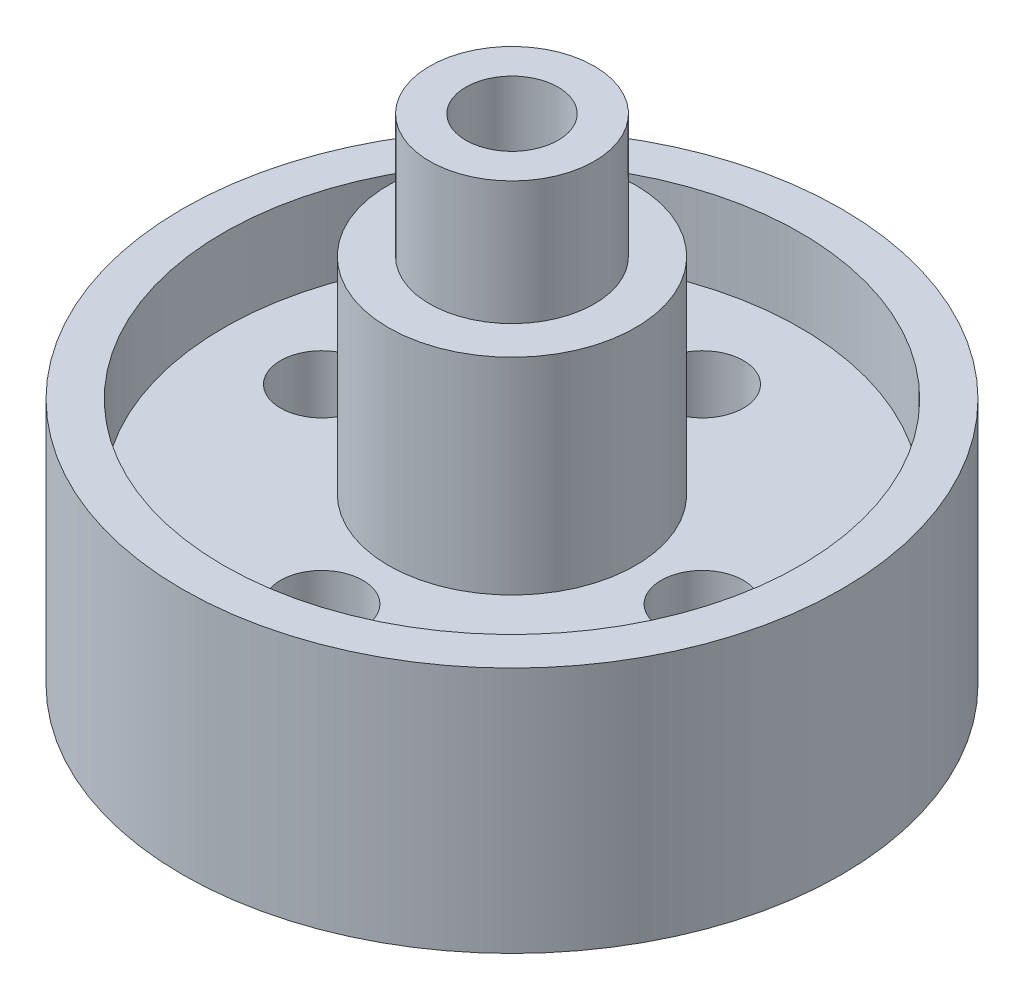
ISO-10303-21;
HEADER;
FILE_DESCRIPTION(('STEP AP214'),'2;1');
FILE_NAME('part.step','',(''),(''),'','','');
FILE_SCHEMA(('AUTOMOTIVE_DESIGN { 1 0 10303 214 1 1 1 1 }'));
ENDSEC;
DATA;
#1=APPLICATION_CONTEXT('core data for automotive mechanical design processes');
#2=APPLICATION_PROTOCOL_DEFINITION('international standard','automotive_design',2000,#1);
#3=PRODUCT_CONTEXT('',#1,'mechanical');
#4=PRODUCT('Part','Part','',(#3));
#5=PRODUCT_RELATED_PRODUCT_CATEGORY('part','',(#4));
#6=PRODUCT_DEFINITION_FORMATION('','',#4);
#7=PRODUCT_DEFINITION_CONTEXT('part definition',#1,'design');
#8=PRODUCT_DEFINITION('design','',#6,#7);
#9=PRODUCT_DEFINITION_SHAPE('','',#8);
#10=(LENGTH_UNIT() NAMED_UNIT(*) SI_UNIT(.MILLI.,.METRE.));
#11=(NAMED_UNIT(*) PLANE_ANGLE_UNIT() SI_UNIT($,.RADIAN.));
#12=(NAMED_UNIT(*) SI_UNIT($,.STERADIAN.) SOLID_ANGLE_UNIT());
#13=UNCERTAINTY_MEASURE_WITH_UNIT(LENGTH_MEASURE(1.E-05),#10,'distance_accuracy_value','');
#14=(GEOMETRIC_REPRESENTATION_CONTEXT(3) GLOBAL_UNCERTAINTY_ASSIGNED_CONTEXT((#13)) GLOBAL_UNIT_ASSIGNED_CONTEXT((#10,
#11,#12)) REPRESENTATION_CONTEXT('',''));
#15=CARTESIAN_POINT('',(0.,0.,0.));
#16=DIRECTION('',(0.,0.,1.));
#17=DIRECTION('',(1.,0.,0.));
#18=AXIS2_PLACEMENT_3D('',#15,#16,#17);
#19=CARTESIAN_POINT('',(0.,25.4,0.));
#20=DIRECTION('',(0.,-1.,0.));
#21=DIRECTION('',(0.,0.,-1.));
#22=AXIS2_PLACEMENT_3D('',#19,#20,#21);
#23=CYLINDRICAL_SURFACE('',#22,50.8);
#24=CARTESIAN_POINT('',(0.,0.,0.));
#25=DIRECTION('',(0.,1.,0.));
#26=DIRECTION('',(0.,0.,1.));
#27=AXIS2_PLACEMENT_3D('',#24,#25,#26);
#28=CIRCLE('',#27,50.8);
#29=CARTESIAN_POINT('',(0.,0.,50.8));
#30=VERTEX_POINT('',#29);
#31=EDGE_CURVE('E42',#30,#30,#28,.T.);
#32=ORIENTED_EDGE('',*,*,#31,.T.);
#33=EDGE_LOOP('',(#32));
#34=FACE_BOUND('',#33,.T.);
#35=CARTESIAN_POINT('',(0.,38.1,0.));
#36=DIRECTION('',(0.,1.,0.));
#37=DIRECTION('',(0.,0.,1.));
#38=AXIS2_PLACEMENT_3D('',#35,#36,#37);
#39=CIRCLE('',#38,50.8);
#40=CARTESIAN_POINT('',(0.,38.1,50.8));
#41=VERTEX_POINT('',#40);
#42=EDGE_CURVE('E56',#41,#41,#39,.T.);
#43=ORIENTED_EDGE('',*,*,#42,.F.);
#44=EDGE_LOOP('',(#43));
#45=FACE_BOUND('',#44,.T.);
#46=ADVANCED_FACE('F31',(#34,#45),#23,.T.);
#47=CARTESIAN_POINT('',(0.,0.,0.));
#48=DIRECTION('',(0.,1.,0.));
#49=DIRECTION('',(0.,0.,1.));
#50=AXIS2_PLACEMENT_3D('',#47,#48,#49);
#51=PLANE('',#50);
#52=CARTESIAN_POINT('',(-29.337,0.,0.));
#53=DIRECTION('',(0.,1.,0.));
#54=DIRECTION('',(0.,0.,1.));
#55=AXIS2_PLACEMENT_3D('',#52,#53,#54);
#56=CIRCLE('',#55,6.35);
#57=CARTESIAN_POINT('',(-29.337,0.,6.35));
#58=VERTEX_POINT('',#57);
#59=EDGE_CURVE('E123',#58,#58,#56,.T.);
#60=ORIENTED_EDGE('',*,*,#59,.T.);
#61=EDGE_LOOP('',(#60));
#62=FACE_BOUND('',#61,.T.);
#63=CARTESIAN_POINT('',(1.02429588037641E-13,0.,-29.337));
#64=DIRECTION('',(0.,1.,0.));
#65=DIRECTION('',(0.,0.,1.));
#66=AXIS2_PLACEMENT_3D('',#63,#64,#65);
#67=CIRCLE('',#66,6.35);
#68=CARTESIAN_POINT('',(1.02429588037641E-13,0.,-22.987));
#69=VERTEX_POINT('',#68);
#70=EDGE_CURVE('E127',#69,#69,#67,.T.);
#71=ORIENTED_EDGE('',*,*,#70,.T.);
#72=EDGE_LOOP('',(#71));
#73=FACE_BOUND('',#72,.T.);
#74=CARTESIAN_POINT('',(29.337,0.,2.04859176075282E-13));
#75=DIRECTION('',(0.,1.,0.));
#76=DIRECTION('',(0.,0.,1.));
#77=AXIS2_PLACEMENT_3D('',#74,#75,#76);
#78=CIRCLE('',#77,6.35);
#79=CARTESIAN_POINT('',(29.337,0.,6.35000000000021));
#80=VERTEX_POINT('',#79);
#81=EDGE_CURVE('E137',#80,#80,#78,.T.);
#82=ORIENTED_EDGE('',*,*,#81,.T.);
#83=EDGE_LOOP('',(#82));
#84=FACE_BOUND('',#83,.T.);
#85=CARTESIAN_POINT('',(-3.07288764112923E-13,0.,29.337));
#86=DIRECTION('',(0.,1.,0.));
#87=DIRECTION('',(0.,0.,1.));
#88=AXIS2_PLACEMENT_3D('',#85,#86,#87);
#89=CIRCLE('',#88,6.35);
#90=CARTESIAN_POINT('',(-3.07288764112923E-13,0.,35.687));
#91=VERTEX_POINT('',#90);
#92=EDGE_CURVE('E143',#91,#91,#89,.T.);
#93=ORIENTED_EDGE('',*,*,#92,.T.);
#94=EDGE_LOOP('',(#93));
#95=FACE_BOUND('',#94,.T.);
#96=CARTESIAN_POINT('',(0.,0.,0.));
#97=DIRECTION('',(0.,1.,0.));
#98=DIRECTION('',(0.,0.,1.));
#99=AXIS2_PLACEMENT_3D('',#96,#97,#98);
#100=CIRCLE('',#99,7.112);
#101=CARTESIAN_POINT('',(0.,0.,7.112));
#102=VERTEX_POINT('',#101);
#103=EDGE_CURVE('E149',#102,#102,#100,.T.);
#104=ORIENTED_EDGE('',*,*,#103,.T.);
#105=EDGE_LOOP('',(#104));
#106=FACE_BOUND('',#105,.T.);
#107=ORIENTED_EDGE('',*,*,#31,.F.);
#108=EDGE_LOOP('',(#107));
#109=FACE_BOUND('',#108,.T.);
#110=ADVANCED_FACE('F63',(#62,#73,#84,#95,#106,#109),#51,.F.);
#111=CARTESIAN_POINT('',(0.,38.1,0.));
#112=DIRECTION('',(0.,1.,0.));
#113=DIRECTION('',(0.,0.,1.));
#114=AXIS2_PLACEMENT_3D('',#111,#112,#113);
#115=PLANE('',#114);
#116=ORIENTED_EDGE('',*,*,#42,.T.);
#117=EDGE_LOOP('',(#116));
#118=FACE_BOUND('',#117,.T.);
#119=CARTESIAN_POINT('',(0.,38.1,0.));
#120=DIRECTION('',(0.,1.,0.));
#121=DIRECTION('',(0.,0.,1.));
#122=AXIS2_PLACEMENT_3D('',#119,#120,#121);
#123=CIRCLE('',#122,44.45);
#124=CARTESIAN_POINT('',(0.,38.1,44.45));
#125=VERTEX_POINT('',#124);
#126=EDGE_CURVE('E50',#125,#125,#123,.T.);
#127=ORIENTED_EDGE('',*,*,#126,.F.);
#128=EDGE_LOOP('',(#127));
#129=FACE_BOUND('',#128,.T.);
#130=ADVANCED_FACE('F65',(#118,#129),#115,.T.);
#131=CARTESIAN_POINT('',(0.,38.1,0.));
#132=DIRECTION('',(0.,-1.,0.));
#133=DIRECTION('',(0.,0.,-1.));
#134=AXIS2_PLACEMENT_3D('',#131,#132,#133);
#135=CYLINDRICAL_SURFACE('',#134,44.45);
#136=ORIENTED_EDGE('',*,*,#126,.T.);
#137=EDGE_LOOP('',(#136));
#138=FACE_BOUND('',#137,.T.);
#139=CARTESIAN_POINT('',(0.,25.4,0.));
#140=DIRECTION('',(0.,1.,0.));
#141=DIRECTION('',(0.,0.,1.));
#142=AXIS2_PLACEMENT_3D('',#139,#140,#141);
#143=CIRCLE('',#142,44.45);
#144=CARTESIAN_POINT('',(0.,25.4,44.45));
#145=VERTEX_POINT('',#144);
#146=EDGE_CURVE('E34',#145,#145,#143,.F.);
#147=ORIENTED_EDGE('',*,*,#146,.T.);
#148=EDGE_LOOP('',(#147));
#149=FACE_BOUND('',#148,.T.);
#150=ADVANCED_FACE('F71',(#138,#149),#135,.F.);
#151=CARTESIAN_POINT('',(0.,25.4,0.));
#152=DIRECTION('',(0.,1.,0.));
#153=DIRECTION('',(0.,0.,1.));
#154=AXIS2_PLACEMENT_3D('',#151,#152,#153);
#155=PLANE('',#154);
#156=CARTESIAN_POINT('',(-29.337,25.4,0.));
#157=DIRECTION('',(0.,1.,0.));
#158=DIRECTION('',(0.,0.,1.));
#159=AXIS2_PLACEMENT_3D('',#156,#157,#158);
#160=CIRCLE('',#159,6.35);
#161=CARTESIAN_POINT('',(-29.337,25.4,6.35));
#162=VERTEX_POINT('',#161);
#163=EDGE_CURVE('E126',#162,#162,#160,.T.);
#164=ORIENTED_EDGE('',*,*,#163,.F.);
#165=EDGE_LOOP('',(#164));
#166=FACE_BOUND('',#165,.T.);
#167=CARTESIAN_POINT('',(1.02429588037641E-13,25.4,-29.337));
#168=DIRECTION('',(0.,1.,0.));
#169=DIRECTION('',(0.,0.,1.));
#170=AXIS2_PLACEMENT_3D('',#167,#168,#169);
#171=CIRCLE('',#170,6.35);
#172=CARTESIAN_POINT('',(1.02429588037641E-13,25.4,-22.987));
#173=VERTEX_POINT('',#172);
#174=EDGE_CURVE('E132',#173,#173,#171,.T.);
#175=ORIENTED_EDGE('',*,*,#174,.F.);
#176=EDGE_LOOP('',(#175));
#177=FACE_BOUND('',#176,.T.);
#178=CARTESIAN_POINT('',(29.337,25.4,2.04859176075282E-13));
#179=DIRECTION('',(0.,1.,0.));
#180=DIRECTION('',(0.,0.,1.));
#181=AXIS2_PLACEMENT_3D('',#178,#179,#180);
#182=CIRCLE('',#181,6.35);
#183=CARTESIAN_POINT('',(29.337,25.4,6.35000000000021));
#184=VERTEX_POINT('',#183);
#185=EDGE_CURVE('E140',#184,#184,#182,.T.);
#186=ORIENTED_EDGE('',*,*,#185,.F.);
#187=EDGE_LOOP('',(#186));
#188=FACE_BOUND('',#187,.T.);
#189=CARTESIAN_POINT('',(-3.07288764112923E-13,25.4,29.337));
#190=DIRECTION('',(0.,1.,0.));
#191=DIRECTION('',(0.,0.,1.));
#192=AXIS2_PLACEMENT_3D('',#189,#190,#191);
#193=CIRCLE('',#192,6.35);
#194=CARTESIAN_POINT('',(-3.07288764112923E-13,25.4,35.687));
#195=VERTEX_POINT('',#194);
#196=EDGE_CURVE('E146',#195,#195,#193,.T.);
#197=ORIENTED_EDGE('',*,*,#196,.F.);
#198=EDGE_LOOP('',(#197));
#199=FACE_BOUND('',#198,.T.);
#200=CARTESIAN_POINT('',(0.,25.4,0.));
#201=DIRECTION('',(0.,1.,0.));
#202=DIRECTION('',(0.,0.,1.));
#203=AXIS2_PLACEMENT_3D('',#200,#201,#202);
#204=CIRCLE('',#203,19.05);
#205=CARTESIAN_POINT('',(0.,25.4,19.05));
#206=VERTEX_POINT('',#205);
#207=EDGE_CURVE('E51',#206,#206,#204,.T.);
#208=ORIENTED_EDGE('',*,*,#207,.F.);
#209=EDGE_LOOP('',(#208));
#210=FACE_BOUND('',#209,.T.);
#211=ORIENTED_EDGE('',*,*,#146,.F.);
#212=EDGE_LOOP('',(#211));
#213=FACE_BOUND('',#212,.T.);
#214=ADVANCED_FACE('F77',(#166,#177,#188,#199,#210,#213),#155,.T.);
#215=CARTESIAN_POINT('',(0.,57.15,0.));
#216=DIRECTION('',(0.,-1.,0.));
#217=DIRECTION('',(0.,0.,-1.));
#218=AXIS2_PLACEMENT_3D('',#215,#216,#217);
#219=CYLINDRICAL_SURFACE('',#218,19.05);
#220=CARTESIAN_POINT('',(0.,57.15,0.));
#221=DIRECTION('',(0.,1.,0.));
#222=DIRECTION('',(0.,0.,1.));
#223=AXIS2_PLACEMENT_3D('',#220,#221,#222);
#224=CIRCLE('',#223,19.05);
#225=CARTESIAN_POINT('',(0.,57.15,19.05));
#226=VERTEX_POINT('',#225);
#227=EDGE_CURVE('E47',#226,#226,#224,.T.);
#228=ORIENTED_EDGE('',*,*,#227,.F.);
#229=EDGE_LOOP('',(#228));
#230=FACE_BOUND('',#229,.T.);
#231=ORIENTED_EDGE('',*,*,#207,.T.);
#232=EDGE_LOOP('',(#231));
#233=FACE_BOUND('',#232,.T.);
#234=ADVANCED_FACE('F79',(#230,#233),#219,.T.);
#235=CARTESIAN_POINT('',(0.,57.15,0.));
#236=DIRECTION('',(0.,1.,0.));
#237=DIRECTION('',(0.,0.,1.));
#238=AXIS2_PLACEMENT_3D('',#235,#236,#237);
#239=PLANE('',#238);
#240=CARTESIAN_POINT('',(0.,57.15,0.));
#241=DIRECTION('',(0.,1.,0.));
#242=DIRECTION('',(0.,0.,1.));
#243=AXIS2_PLACEMENT_3D('',#240,#241,#242);
#244=CIRCLE('',#243,12.7);
#245=CARTESIAN_POINT('',(0.,57.15,-12.7));
#246=VERTEX_POINT('',#245);
#247=EDGE_CURVE('E10',#246,#246,#244,.T.);
#248=ORIENTED_EDGE('',*,*,#247,.F.);
#249=EDGE_LOOP('',(#248));
#250=FACE_BOUND('',#249,.T.);
#251=ORIENTED_EDGE('',*,*,#227,.T.);
#252=EDGE_LOOP('',(#251));
#253=FACE_BOUND('',#252,.T.);
#254=ADVANCED_FACE('F87',(#250,#253),#239,.T.);
#255=CARTESIAN_POINT('',(0.,76.2,0.));
#256=DIRECTION('',(0.,-1.,0.));
#257=DIRECTION('',(0.,0.,-1.));
#258=AXIS2_PLACEMENT_3D('',#255,#256,#257);
#259=CYLINDRICAL_SURFACE('',#258,12.7);
#260=CARTESIAN_POINT('',(0.,76.2,0.));
#261=DIRECTION('',(0.,1.,0.));
#262=DIRECTION('',(0.,0.,1.));
#263=AXIS2_PLACEMENT_3D('',#260,#261,#262);
#264=CIRCLE('',#263,12.7);
#265=CARTESIAN_POINT('',(0.,76.2,-12.7));
#266=VERTEX_POINT('',#265);
#267=EDGE_CURVE('E45',#266,#266,#264,.T.);
#268=CARTESIAN_POINT('',(0.,76.2,-12.7));
#269=CARTESIAN_POINT('',(0.,76.0015625,-12.7));
#270=CARTESIAN_POINT('',(0.,75.803125,-12.7));
#271=CARTESIAN_POINT('',(0.,75.40625,-12.7));
#272=CARTESIAN_POINT('',(0.,75.2078125,-12.7));
#273=CARTESIAN_POINT('',(0.,74.8109375,-12.7));
#274=CARTESIAN_POINT('',(0.,74.6125,-12.7));
#275=CARTESIAN_POINT('',(0.,74.215625,-12.7));
#276=CARTESIAN_POINT('',(0.,74.0171875,-12.7));
#277=CARTESIAN_POINT('',(0.,73.6203125,-12.7));
#278=CARTESIAN_POINT('',(0.,73.421875,-12.7));
#279=CARTESIAN_POINT('',(0.,73.025,-12.7));
#280=CARTESIAN_POINT('',(0.,72.8265625,-12.7));
#281=CARTESIAN_POINT('',(0.,72.4296875,-12.7));
#282=CARTESIAN_POINT('',(0.,72.23125,-12.7));
#283=CARTESIAN_POINT('',(0.,71.834375,-12.7));
#284=CARTESIAN_POINT('',(0.,71.6359375,-12.7));
#285=CARTESIAN_POINT('',(0.,71.2390625,-12.7));
#286=CARTESIAN_POINT('',(0.,71.040625,-12.7));
#287=CARTESIAN_POINT('',(0.,70.64375,-12.7));
#288=CARTESIAN_POINT('',(0.,70.4453125,-12.7));
#289=CARTESIAN_POINT('',(0.,70.0484375,-12.7));
#290=CARTESIAN_POINT('',(0.,69.85,-12.7));
#291=CARTESIAN_POINT('',(0.,69.453125,-12.7));
#292=CARTESIAN_POINT('',(0.,69.2546875,-12.7));
#293=CARTESIAN_POINT('',(0.,68.8578125,-12.7));
#294=CARTESIAN_POINT('',(0.,68.659375,-12.7));
#295=CARTESIAN_POINT('',(0.,68.2625,-12.7));
#296=CARTESIAN_POINT('',(0.,68.0640625,-12.7));
#297=CARTESIAN_POINT('',(0.,67.6671875,-12.7));
#298=CARTESIAN_POINT('',(0.,67.46875,-12.7));
#299=CARTESIAN_POINT('',(0.,67.071875,-12.7));
#300=CARTESIAN_POINT('',(0.,66.8734375,-12.7));
#301=CARTESIAN_POINT('',(0.,66.4765625,-12.7));
#302=CARTESIAN_POINT('',(0.,66.278125,-12.7));
#303=CARTESIAN_POINT('',(0.,65.88125,-12.7));
#304=CARTESIAN_POINT('',(0.,65.6828125,-12.7));
#305=CARTESIAN_POINT('',(0.,65.2859375,-12.7));
#306=CARTESIAN_POINT('',(0.,65.0875,-12.7));
#307=CARTESIAN_POINT('',(0.,64.690625,-12.7));
#308=CARTESIAN_POINT('',(0.,64.4921875,-12.7));
#309=CARTESIAN_POINT('',(0.,64.0953125,-12.7));
#310=CARTESIAN_POINT('',(0.,63.896875,-12.7));
#311=CARTESIAN_POINT('',(0.,63.5,-12.7));
#312=CARTESIAN_POINT('',(0.,63.3015625,-12.7));
#313=CARTESIAN_POINT('',(0.,62.9046875,-12.7));
#314=CARTESIAN_POINT('',(0.,62.70625,-12.7));
#315=CARTESIAN_POINT('',(0.,62.309375,-12.7));
#316=CARTESIAN_POINT('',(0.,62.1109375,-12.7));
#317=CARTESIAN_POINT('',(0.,61.7140625,-12.7));
#318=CARTESIAN_POINT('',(0.,61.515625,-12.7));
#319=CARTESIAN_POINT('',(0.,61.11875,-12.7));
#320=CARTESIAN_POINT('',(0.,60.9203125,-12.7));
#321=CARTESIAN_POINT('',(0.,60.5234375,-12.7));
#322=CARTESIAN_POINT('',(0.,60.325,-12.7));
#323=CARTESIAN_POINT('',(0.,59.928125,-12.7));
#324=CARTESIAN_POINT('',(0.,59.7296875,-12.7));
#325=CARTESIAN_POINT('',(0.,59.3328125,-12.7));
#326=CARTESIAN_POINT('',(0.,59.134375,-12.7));
#327=CARTESIAN_POINT('',(0.,58.7375,-12.7));
#328=CARTESIAN_POINT('',(0.,58.5390625,-12.7));
#329=CARTESIAN_POINT('',(0.,58.1421875,-12.7));
#330=CARTESIAN_POINT('',(0.,57.94375,-12.7));
#331=CARTESIAN_POINT('',(0.,57.546875,-12.7));
#332=CARTESIAN_POINT('',(0.,57.3484375,-12.7));
#333=CARTESIAN_POINT('',(0.,57.15,-12.7));
#334=B_SPLINE_CURVE_WITH_KNOTS('',3,(#268,#269,#270,#271,#272,#273,#274,#275,#276,#277,#278,
#279,#280,#281,#282,#283,#284,#285,#286,#287,#288,#289,#290,#291,#292,#293,#294,#295,#296,#297,
#298,#299,#300,#301,#302,#303,#304,#305,#306,#307,#308,#309,#310,#311,#312,#313,#314,#315,#316,
#317,#318,#319,#320,#321,#322,#323,#324,#325,#326,#327,#328,#329,#330,#331,#332,#333),
.UNSPECIFIED.,.F.,.F.,(4,2,2,2,2,2,2,2,2,2,2,2,2,2,2,2,2,2,2,2,2,2,2,2,2,2,2,2,2,2,2,2,4),(0.,
0.5953125,1.190625,1.7859375,2.38125,2.9765625,3.571875,4.1671875,4.7625,5.3578125,5.953125,
6.5484375,7.14375,7.7390625,8.334375,8.92968750000001,9.52500000000001,10.1203125,10.715625,
11.3109375,11.90625,12.5015625,13.096875,13.6921875,14.2875,14.8828125,15.478125,16.0734375,
16.66875,17.2640625,17.859375,18.4546875,19.05),.UNSPECIFIED.);
#335=EDGE_CURVE('BSEAM91',#266,#246,#334,.T.);
#336=ORIENTED_EDGE('',*,*,#267,.F.);
#337=ORIENTED_EDGE('',*,*,#247,.T.);
#338=ORIENTED_EDGE('',*,*,#335,.T.);
#339=ORIENTED_EDGE('',*,*,#335,.F.);
#340=EDGE_LOOP('',(#336,#338,#337,#339));
#341=FACE_BOUND('',#340,.T.);
#342=ADVANCED_FACE('F91',(#341),#259,.T.);
#343=CARTESIAN_POINT('',(0.,76.2,0.));
#344=DIRECTION('',(0.,1.,0.));
#345=DIRECTION('',(0.,0.,1.));
#346=AXIS2_PLACEMENT_3D('',#343,#344,#345);
#347=PLANE('',#346);
#348=CARTESIAN_POINT('',(0.,76.2,0.));
#349=DIRECTION('',(0.,1.,0.));
#350=DIRECTION('',(0.,0.,1.));
#351=AXIS2_PLACEMENT_3D('',#348,#349,#350);
#352=CIRCLE('',#351,7.112);
#353=CARTESIAN_POINT('',(0.,76.2,7.112));
#354=VERTEX_POINT('',#353);
#355=EDGE_CURVE('E129',#354,#354,#352,.T.);
#356=ORIENTED_EDGE('',*,*,#355,.F.);
#357=EDGE_LOOP('',(#356));
#358=FACE_BOUND('',#357,.T.);
#359=ORIENTED_EDGE('',*,*,#267,.T.);
#360=EDGE_LOOP('',(#359));
#361=FACE_BOUND('',#360,.T.);
#362=ADVANCED_FACE('F95',(#358,#361),#347,.T.);
#363=CARTESIAN_POINT('',(0.,0.,0.));
#364=DIRECTION('',(0.,1.,0.));
#365=DIRECTION('',(0.,0.,1.));
#366=AXIS2_PLACEMENT_3D('',#363,#364,#365);
#367=CYLINDRICAL_SURFACE('',#366,7.112);
#368=CARTESIAN_POINT('',(0.,0.,7.112));
#369=CARTESIAN_POINT('',(0.,0.79375,7.112));
#370=CARTESIAN_POINT('',(0.,1.5875,7.112));
#371=CARTESIAN_POINT('',(0.,3.175,7.112));
#372=CARTESIAN_POINT('',(0.,3.96875,7.112));
#373=CARTESIAN_POINT('',(0.,5.55625,7.112));
#374=CARTESIAN_POINT('',(0.,6.35,7.112));
#375=CARTESIAN_POINT('',(0.,7.9375,7.112));
#376=CARTESIAN_POINT('',(0.,8.73125,7.112));
#377=CARTESIAN_POINT('',(0.,10.31875,7.112));
#378=CARTESIAN_POINT('',(0.,11.1125,7.112));
#379=CARTESIAN_POINT('',(0.,12.7,7.112));
#380=CARTESIAN_POINT('',(0.,13.49375,7.112));
#381=CARTESIAN_POINT('',(0.,15.08125,7.112));
#382=CARTESIAN_POINT('',(0.,15.875,7.112));
#383=CARTESIAN_POINT('',(0.,17.4625,7.112));
#384=CARTESIAN_POINT('',(0.,18.25625,7.112));
#385=CARTESIAN_POINT('',(0.,19.84375,7.112));
#386=CARTESIAN_POINT('',(0.,20.6375,7.112));
#387=CARTESIAN_POINT('',(0.,22.225,7.112));
#388=CARTESIAN_POINT('',(0.,23.01875,7.112));
#389=CARTESIAN_POINT('',(0.,24.60625,7.112));
#390=CARTESIAN_POINT('',(0.,25.4,7.112));
#391=CARTESIAN_POINT('',(0.,26.9875,7.112));
#392=CARTESIAN_POINT('',(0.,27.78125,7.112));
#393=CARTESIAN_POINT('',(0.,29.36875,7.112));
#394=CARTESIAN_POINT('',(0.,30.1625,7.112));
#395=CARTESIAN_POINT('',(0.,31.75,7.112));
#396=CARTESIAN_POINT('',(0.,32.54375,7.112));
#397=CARTESIAN_POINT('',(0.,34.13125,7.112));
#398=CARTESIAN_POINT('',(0.,34.925,7.112));
#399=CARTESIAN_POINT('',(0.,36.5125,7.112));
#400=CARTESIAN_POINT('',(0.,37.30625,7.112));
#401=CARTESIAN_POINT('',(0.,38.89375,7.112));
#402=CARTESIAN_POINT('',(0.,39.6875,7.112));
#403=CARTESIAN_POINT('',(0.,41.275,7.112));
#404=CARTESIAN_POINT('',(0.,42.06875,7.112));
#405=CARTESIAN_POINT('',(0.,43.65625,7.112));
#406=CARTESIAN_POINT('',(0.,44.45,7.112));
#407=CARTESIAN_POINT('',(0.,46.0375,7.112));
#408=CARTESIAN_POINT('',(0.,46.83125,7.112));
#409=CARTESIAN_POINT('',(0.,48.41875,7.112));
#410=CARTESIAN_POINT('',(0.,49.2125,7.112));
#411=CARTESIAN_POINT('',(0.,50.8,7.112));
#412=CARTESIAN_POINT('',(0.,51.59375,7.112));
#413=CARTESIAN_POINT('',(0.,53.18125,7.112));
#414=CARTESIAN_POINT('',(0.,53.975,7.112));
#415=CARTESIAN_POINT('',(0.,55.5625,7.112));
#416=CARTESIAN_POINT('',(0.,56.35625,7.112));
#417=CARTESIAN_POINT('',(0.,57.94375,7.112));
#418=CARTESIAN_POINT('',(0.,58.7375,7.112));
#419=CARTESIAN_POINT('',(0.,60.325,7.112));
#420=CARTESIAN_POINT('',(0.,61.11875,7.112));
#421=CARTESIAN_POINT('',(0.,62.70625,7.112));
#422=CARTESIAN_POINT('',(0.,63.5,7.112));
#423=CARTESIAN_POINT('',(0.,65.0875,7.112));
#424=CARTESIAN_POINT('',(0.,65.88125,7.112));
#425=CARTESIAN_POINT('',(0.,67.46875,7.112));
#426=CARTESIAN_POINT('',(0.,68.2625,7.112));
#427=CARTESIAN_POINT('',(0.,69.85,7.112));
#428=CARTESIAN_POINT('',(0.,70.64375,7.112));
#429=CARTESIAN_POINT('',(0.,72.23125,7.112));
#430=CARTESIAN_POINT('',(0.,73.025,7.112));
#431=CARTESIAN_POINT('',(0.,74.6125,7.112));
#432=CARTESIAN_POINT('',(0.,75.40625,7.112));
#433=CARTESIAN_POINT('',(0.,76.2,7.112));
#434=B_SPLINE_CURVE_WITH_KNOTS('',3,(#368,#369,#370,#371,#372,#373,#374,#375,#376,#377,#378,
#379,#380,#381,#382,#383,#384,#385,#386,#387,#388,#389,#390,#391,#392,#393,#394,#395,#396,#397,
#398,#399,#400,#401,#402,#403,#404,#405,#406,#407,#408,#409,#410,#411,#412,#413,#414,#415,#416,
#417,#418,#419,#420,#421,#422,#423,#424,#425,#426,#427,#428,#429,#430,#431,#432,#433),
.UNSPECIFIED.,.F.,.F.,(4,2,2,2,2,2,2,2,2,2,2,2,2,2,2,2,2,2,2,2,2,2,2,2,2,2,2,2,2,2,2,2,4),(0.,
2.38125,4.7625,7.14375,9.525,11.90625,14.2875,16.66875,19.05,21.43125,23.8125,26.19375,28.575,
30.95625,33.3375,35.71875,38.1,40.48125,42.8625,45.24375,47.625,50.00625,52.3875,54.76875,57.15,
59.53125,61.9125,64.29375,66.675,69.05625,71.4375,73.81875,76.2),.UNSPECIFIED.);
#435=EDGE_CURVE('BSEAM99',#102,#354,#434,.T.);
#436=ORIENTED_EDGE('',*,*,#103,.F.);
#437=ORIENTED_EDGE('',*,*,#355,.T.);
#438=ORIENTED_EDGE('',*,*,#435,.T.);
#439=ORIENTED_EDGE('',*,*,#435,.F.);
#440=EDGE_LOOP('',(#436,#438,#437,#439));
#441=FACE_BOUND('',#440,.T.);
#442=ADVANCED_FACE('F99',(#441),#367,.F.);
#443=CARTESIAN_POINT('',(-3.07288764112923E-13,0.,29.337));
#444=DIRECTION('',(0.,1.,0.));
#445=DIRECTION('',(0.,0.,1.));
#446=AXIS2_PLACEMENT_3D('',#443,#444,#445);
#447=CYLINDRICAL_SURFACE('',#446,6.35);
#448=ORIENTED_EDGE('',*,*,#92,.F.);
#449=EDGE_LOOP('',(#448));
#450=FACE_BOUND('',#449,.T.);
#451=ORIENTED_EDGE('',*,*,#196,.T.);
#452=EDGE_LOOP('',(#451));
#453=FACE_BOUND('',#452,.T.);
#454=ADVANCED_FACE('F103',(#450,#453),#447,.F.);
#455=CARTESIAN_POINT('',(29.337,0.,2.04859176075282E-13));
#456=DIRECTION('',(0.,1.,0.));
#457=DIRECTION('',(0.,0.,1.));
#458=AXIS2_PLACEMENT_3D('',#455,#456,#457);
#459=CYLINDRICAL_SURFACE('',#458,6.35);
#460=ORIENTED_EDGE('',*,*,#81,.F.);
#461=EDGE_LOOP('',(#460));
#462=FACE_BOUND('',#461,.T.);
#463=ORIENTED_EDGE('',*,*,#185,.T.);
#464=EDGE_LOOP('',(#463));
#465=FACE_BOUND('',#464,.T.);
#466=ADVANCED_FACE('F107',(#462,#465),#459,.F.);
#467=CARTESIAN_POINT('',(1.02429588037641E-13,0.,-29.337));
#468=DIRECTION('',(0.,1.,0.));
#469=DIRECTION('',(0.,0.,1.));
#470=AXIS2_PLACEMENT_3D('',#467,#468,#469);
#471=CYLINDRICAL_SURFACE('',#470,6.35);
#472=ORIENTED_EDGE('',*,*,#70,.F.);
#473=EDGE_LOOP('',(#472));
#474=FACE_BOUND('',#473,.T.);
#475=ORIENTED_EDGE('',*,*,#174,.T.);
#476=EDGE_LOOP('',(#475));
#477=FACE_BOUND('',#476,.T.);
#478=ADVANCED_FACE('F111',(#474,#477),#471,.F.);
#479=CARTESIAN_POINT('',(-29.337,0.,0.));
#480=DIRECTION('',(0.,1.,0.));
#481=DIRECTION('',(0.,0.,1.));
#482=AXIS2_PLACEMENT_3D('',#479,#480,#481);
#483=CYLINDRICAL_SURFACE('',#482,6.35);
#484=ORIENTED_EDGE('',*,*,#59,.F.);
#485=EDGE_LOOP('',(#484));
#486=FACE_BOUND('',#485,.T.);
#487=ORIENTED_EDGE('',*,*,#163,.T.);
#488=EDGE_LOOP('',(#487));
#489=FACE_BOUND('',#488,.T.);
#490=ADVANCED_FACE('F115',(#486,#489),#483,.F.);
#491=CLOSED_SHELL('',(#46,#110,#130,#150,#214,#234,#254,#342,#362,#442,#454,#466,#478,#490));
#492=MANIFOLD_SOLID_BREP('B2',#491);
#493=ADVANCED_BREP_SHAPE_REPRESENTATION('',(#18,#492),#14);
#494=SHAPE_DEFINITION_REPRESENTATION(#9,#493);
ENDSEC;
END-ISO-10303-21;
